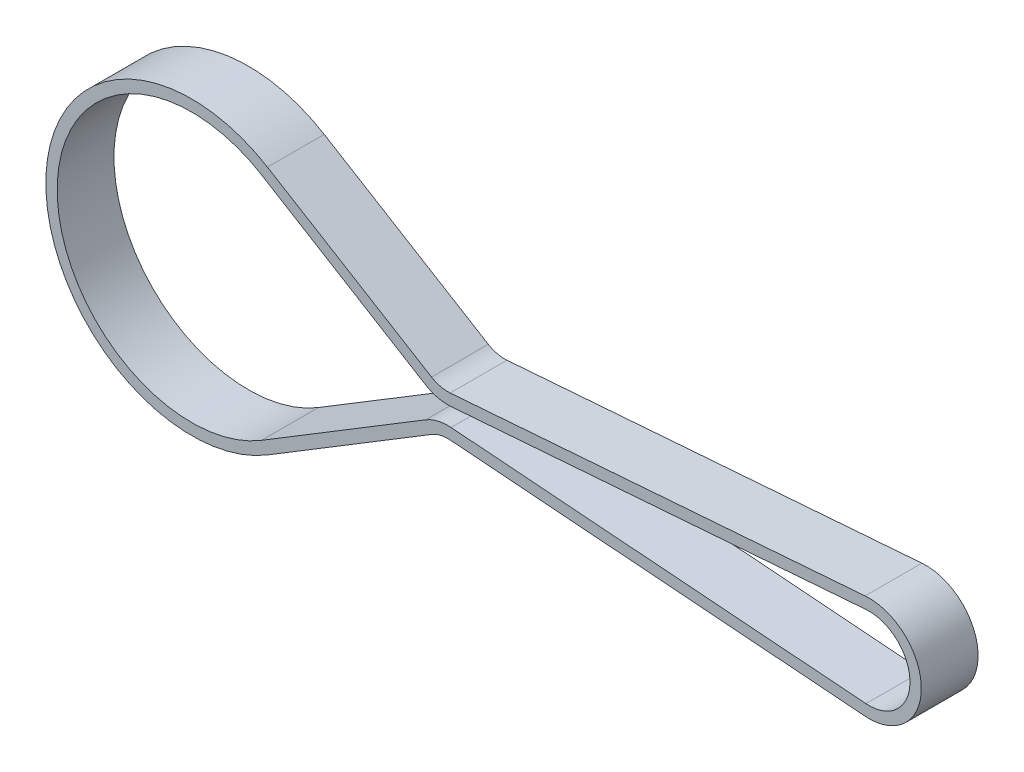
ISO-10303-21;
HEADER;
FILE_DESCRIPTION(('STEP AP214'),'2;1');
FILE_NAME('part.step','',(''),(''),'','','');
FILE_SCHEMA(('AUTOMOTIVE_DESIGN { 1 0 10303 214 1 1 1 1 }'));
ENDSEC;
DATA;
#1=APPLICATION_CONTEXT('core data for automotive mechanical design processes');
#2=APPLICATION_PROTOCOL_DEFINITION('international standard','automotive_design',2000,#1);
#3=PRODUCT_CONTEXT('',#1,'mechanical');
#4=PRODUCT('Part','Part','',(#3));
#5=PRODUCT_RELATED_PRODUCT_CATEGORY('part','',(#4));
#6=PRODUCT_DEFINITION_FORMATION('','',#4);
#7=PRODUCT_DEFINITION_CONTEXT('part definition',#1,'design');
#8=PRODUCT_DEFINITION('design','',#6,#7);
#9=PRODUCT_DEFINITION_SHAPE('','',#8);
#10=(LENGTH_UNIT() NAMED_UNIT(*) SI_UNIT(.MILLI.,.METRE.));
#11=(NAMED_UNIT(*) PLANE_ANGLE_UNIT() SI_UNIT($,.RADIAN.));
#12=(NAMED_UNIT(*) SI_UNIT($,.STERADIAN.) SOLID_ANGLE_UNIT());
#13=UNCERTAINTY_MEASURE_WITH_UNIT(LENGTH_MEASURE(1.E-05),#10,'distance_accuracy_value','');
#14=(GEOMETRIC_REPRESENTATION_CONTEXT(3) GLOBAL_UNCERTAINTY_ASSIGNED_CONTEXT((#13)) GLOBAL_UNIT_ASSIGNED_CONTEXT((#10,
#11,#12)) REPRESENTATION_CONTEXT('',''));
#15=CARTESIAN_POINT('',(0.,0.,0.));
#16=DIRECTION('',(0.,0.,1.));
#17=DIRECTION('',(1.,0.,0.));
#18=AXIS2_PLACEMENT_3D('',#15,#16,#17);
#19=CARTESIAN_POINT('',(-3.15406698387781,5.18620108642833,184.135803480875));
#20=DIRECTION('',(-0.519615593863488,0.854400160705682,0.));
#21=DIRECTION('',(-0.854400160705682,-0.519615593863488,0.));
#22=AXIS2_PLACEMENT_3D('',#19,#20,#21);
#23=PLANE('',#22);
#24=DIRECTION('',(0.854400160705682,0.519615593863488,0.));
#25=VECTOR('',#24,1.);
#26=CARTESIAN_POINT('',(-3.1540669838778,5.18620108642834,5.30000000000083));
#27=LINE('',#26,#25);
#28=CARTESIAN_POINT('',(-34.9478185611982,-14.1496205423417,5.30000000000083));
#29=VERTEX_POINT('',#28);
#30=CARTESIAN_POINT('',(-3.15406698387781,5.18620108642833,5.30000000000083));
#31=VERTEX_POINT('',#30);
#32=EDGE_CURVE('E295',#29,#31,#27,.T.);
#33=ORIENTED_EDGE('',*,*,#32,.F.);
#34=DIRECTION('',(0.,0.,-1.));
#35=VECTOR('',#34,1.);
#36=CARTESIAN_POINT('',(-34.9478185611982,-14.1496205423417,184.135803480875));
#37=LINE('',#36,#35);
#38=CARTESIAN_POINT('',(-34.9478185611982,-14.1496205423417,-5.69999999999917));
#39=VERTEX_POINT('',#38);
#40=EDGE_CURVE('E146',#29,#39,#37,.T.);
#41=ORIENTED_EDGE('',*,*,#40,.T.);
#42=DIRECTION('',(-0.854400160705682,-0.519615593863488,0.));
#43=VECTOR('',#42,1.);
#44=CARTESIAN_POINT('',(-3.15406698387782,5.18620108642833,-5.69999999999918));
#45=LINE('',#44,#43);
#46=CARTESIAN_POINT('',(-3.15406698387781,5.18620108642833,-5.69999999999918));
#47=VERTEX_POINT('',#46);
#48=EDGE_CURVE('E360',#47,#39,#45,.T.);
#49=ORIENTED_EDGE('',*,*,#48,.F.);
#50=DIRECTION('',(0.,0.,-1.));
#51=VECTOR('',#50,1.);
#52=CARTESIAN_POINT('',(-3.15406698387781,5.18620108642833,184.135803480875));
#53=LINE('',#52,#51);
#54=EDGE_CURVE('E251',#31,#47,#53,.T.);
#55=ORIENTED_EDGE('',*,*,#54,.F.);
#56=EDGE_LOOP('',(#33,#41,#49,#55));
#57=FACE_BOUND('',#56,.T.);
#58=ADVANCED_FACE('F131',(#57),#23,.F.);
#59=CARTESIAN_POINT('',(-49.6347533217497,10.0000000000044,184.135803480875));
#60=DIRECTION('',(0.,0.,-1.));
#61=DIRECTION('',(-1.,0.,0.));
#62=AXIS2_PLACEMENT_3D('',#59,#60,#61);
#63=CYLINDRICAL_SURFACE('',#62,28.265);
#64=CARTESIAN_POINT('',(-49.6347533217497,10.0000000000044,5.30000000000086));
#65=DIRECTION('',(0.,0.,1.));
#66=DIRECTION('',(0.,-1.,0.));
#67=AXIS2_PLACEMENT_3D('',#64,#65,#66);
#68=CIRCLE('',#67,28.265);
#69=CARTESIAN_POINT('',(-34.9478276516183,34.1496260708162,5.30000000000083));
#70=VERTEX_POINT('',#69);
#71=EDGE_CURVE('E298',#70,#29,#68,.T.);
#72=ORIENTED_EDGE('',*,*,#71,.F.);
#73=DIRECTION('',(0.,0.,-1.));
#74=VECTOR('',#73,1.);
#75=CARTESIAN_POINT('',(-34.9478276516183,34.1496260708162,184.135803480875));
#76=LINE('',#75,#74);
#77=CARTESIAN_POINT('',(-34.9478276516183,34.1496260708162,-5.69999999999915));
#78=VERTEX_POINT('',#77);
#79=EDGE_CURVE('E334',#70,#78,#76,.T.);
#80=ORIENTED_EDGE('',*,*,#79,.T.);
#81=CARTESIAN_POINT('',(-49.6347533217497,10.0000000000044,-5.69999999999915));
#82=DIRECTION('',(0.,0.,1.));
#83=DIRECTION('',(0.,-1.,0.));
#84=AXIS2_PLACEMENT_3D('',#81,#82,#83);
#85=CIRCLE('',#84,28.265);
#86=EDGE_CURVE('E361',#39,#78,#85,.F.);
#87=ORIENTED_EDGE('',*,*,#86,.F.);
#88=ORIENTED_EDGE('',*,*,#40,.F.);
#89=EDGE_LOOP('',(#72,#80,#87,#88));
#90=FACE_BOUND('',#89,.T.);
#91=ADVANCED_FACE('F411',(#90),#63,.T.);
#92=CARTESIAN_POINT('',(-34.9478276516183,34.1496260708162,184.135803480875));
#93=DIRECTION('',(-0.519615272249474,-0.85440035629973,0.));
#94=DIRECTION('',(0.85440035629973,-0.519615272249474,0.));
#95=AXIS2_PLACEMENT_3D('',#92,#93,#94);
#96=PLANE('',#95);
#97=DIRECTION('',(-0.85440035629973,0.519615272249474,0.));
#98=VECTOR('',#97,1.);
#99=CARTESIAN_POINT('',(-34.9478276516184,34.1496260708163,5.30000000000086));
#100=LINE('',#99,#98);
#101=CARTESIAN_POINT('',(-3.15406203695409,14.8138122993339,5.30000000000086));
#102=VERTEX_POINT('',#101);
#103=EDGE_CURVE('E301',#102,#70,#100,.T.);
#104=ORIENTED_EDGE('',*,*,#103,.F.);
#105=DIRECTION('',(0.,0.,-1.));
#106=VECTOR('',#105,1.);
#107=CARTESIAN_POINT('',(-3.15406203695409,14.8138122993339,184.135803480875));
#108=LINE('',#107,#106);
#109=CARTESIAN_POINT('',(-3.15406203695409,14.8138122993339,-5.69999999999915));
#110=VERTEX_POINT('',#109);
#111=EDGE_CURVE('E336',#102,#110,#108,.T.);
#112=ORIENTED_EDGE('',*,*,#111,.T.);
#113=DIRECTION('',(0.85440035629973,-0.519615272249474,0.));
#114=VECTOR('',#113,1.);
#115=CARTESIAN_POINT('',(-34.9478276516182,34.1496260708162,-5.69999999999915));
#116=LINE('',#115,#114);
#117=EDGE_CURVE('E363',#78,#110,#116,.T.);
#118=ORIENTED_EDGE('',*,*,#117,.F.);
#119=ORIENTED_EDGE('',*,*,#79,.F.);
#120=EDGE_LOOP('',(#104,#112,#118,#119));
#121=FACE_BOUND('',#120,.T.);
#122=ADVANCED_FACE('F416',(#121),#96,.F.);
#123=CARTESIAN_POINT('',(2.66560021278117E-06,20.0000224620733,184.135803480875));
#124=DIRECTION('',(0.,0.,-1.));
#125=DIRECTION('',(-1.,0.,0.));
#126=AXIS2_PLACEMENT_3D('',#123,#124,#125);
#127=CYLINDRICAL_SURFACE('',#126,6.07);
#128=CARTESIAN_POINT('',(2.66560021278117E-06,20.0000224620733,5.30000000000086));
#129=DIRECTION('',(0.,0.,1.));
#130=DIRECTION('',(0.,-1.,0.));
#131=AXIS2_PLACEMENT_3D('',#128,#129,#130);
#132=CIRCLE('',#131,6.07);
#133=CARTESIAN_POINT('',(0.462760138541055,13.9476877455166,5.30000000000086));
#134=VERTEX_POINT('',#133);
#135=EDGE_CURVE('E304',#134,#102,#132,.F.);
#136=ORIENTED_EDGE('',*,*,#135,.F.);
#137=DIRECTION('',(0.,0.,-1.));
#138=VECTOR('',#137,1.);
#139=CARTESIAN_POINT('',(0.462760138541055,13.9476877455166,184.135803480875));
#140=LINE('',#139,#138);
#141=CARTESIAN_POINT('',(0.462760138541055,13.9476877455166,-5.69999999999915));
#142=VERTEX_POINT('',#141);
#143=EDGE_CURVE('E338',#134,#142,#140,.T.);
#144=ORIENTED_EDGE('',*,*,#143,.T.);
#145=CARTESIAN_POINT('',(2.66560021278117E-06,20.0000224620733,-5.69999999999915));
#146=DIRECTION('',(0.,0.,1.));
#147=DIRECTION('',(0.,-1.,0.));
#148=AXIS2_PLACEMENT_3D('',#145,#146,#147);
#149=CIRCLE('',#148,6.07);
#150=EDGE_CURVE('E368',#110,#142,#149,.T.);
#151=ORIENTED_EDGE('',*,*,#150,.F.);
#152=ORIENTED_EDGE('',*,*,#111,.F.);
#153=EDGE_LOOP('',(#136,#144,#151,#152));
#154=FACE_BOUND('',#153,.T.);
#155=ADVANCED_FACE('F423',(#154),#127,.F.);
#156=CARTESIAN_POINT('',(0.462760138541055,13.9476877455166,184.135803480875));
#157=DIRECTION('',(0.0762368159704847,-0.997089739136194,0.));
#158=DIRECTION('',(0.997089739136194,0.0762368159704847,0.));
#159=AXIS2_PLACEMENT_3D('',#156,#157,#158);
#160=PLANE('',#159);
#161=DIRECTION('',(-0.997089739136194,-0.0762368159704847,0.));
#162=VECTOR('',#161,1.);
#163=CARTESIAN_POINT('',(0.462760138541009,13.9476877455166,5.30000000000086));
#164=LINE('',#163,#162);
#165=CARTESIAN_POINT('',(80.8695026026922,20.0955336087548,5.30000000000086));
#166=VERTEX_POINT('',#165);
#167=EDGE_CURVE('E307',#166,#134,#164,.T.);
#168=ORIENTED_EDGE('',*,*,#167,.F.);
#169=DIRECTION('',(0.,0.,-1.));
#170=VECTOR('',#169,1.);
#171=CARTESIAN_POINT('',(80.8695026026922,20.0955336087548,184.135803480875));
#172=LINE('',#171,#170);
#173=CARTESIAN_POINT('',(80.8695026026922,20.0955336087548,-5.69999999999917));
#174=VERTEX_POINT('',#173);
#175=EDGE_CURVE('E340',#166,#174,#172,.T.);
#176=ORIENTED_EDGE('',*,*,#175,.T.);
#177=DIRECTION('',(0.997089739136194,0.0762368159704847,0.));
#178=VECTOR('',#177,1.);
#179=CARTESIAN_POINT('',(0.462760138541101,13.9476877455166,-5.69999999999915));
#180=LINE('',#179,#178);
#181=EDGE_CURVE('E271',#142,#174,#180,.T.);
#182=ORIENTED_EDGE('',*,*,#181,.F.);
#183=ORIENTED_EDGE('',*,*,#143,.F.);
#184=EDGE_LOOP('',(#168,#176,#182,#183));
#185=FACE_BOUND('',#184,.T.);
#186=ADVANCED_FACE('F427',(#185),#160,.F.);
#187=CARTESIAN_POINT('',(81.6414003643934,10.0000000000008,184.135803480875));
#188=DIRECTION('',(0.,0.,-1.));
#189=DIRECTION('',(-1.,0.,0.));
#190=AXIS2_PLACEMENT_3D('',#187,#188,#189);
#191=CYLINDRICAL_SURFACE('',#190,10.125);
#192=CARTESIAN_POINT('',(81.6414003643934,10.0000000000008,5.30000000000083));
#193=DIRECTION('',(0.,0.,1.));
#194=DIRECTION('',(0.,-1.,0.));
#195=AXIS2_PLACEMENT_3D('',#192,#193,#194);
#196=CIRCLE('',#195,10.125);
#197=CARTESIAN_POINT('',(80.8695008121819,-0.0955334718517834,5.30000000000083));
#198=VERTEX_POINT('',#197);
#199=EDGE_CURVE('E310',#198,#166,#196,.T.);
#200=ORIENTED_EDGE('',*,*,#199,.F.);
#201=DIRECTION('',(0.,0.,-1.));
#202=VECTOR('',#201,1.);
#203=CARTESIAN_POINT('',(80.8695008121819,-0.0955334718517834,184.135803480875));
#204=LINE('',#203,#202);
#205=CARTESIAN_POINT('',(80.8695008121819,-0.0955334718517834,-5.69999999999921));
#206=VERTEX_POINT('',#205);
#207=EDGE_CURVE('E342',#198,#206,#204,.T.);
#208=ORIENTED_EDGE('',*,*,#207,.T.);
#209=CARTESIAN_POINT('',(81.6414003643934,10.0000000000008,-5.69999999999918));
#210=DIRECTION('',(0.,0.,1.));
#211=DIRECTION('',(0.,-1.,0.));
#212=AXIS2_PLACEMENT_3D('',#209,#210,#211);
#213=CIRCLE('',#212,10.125);
#214=EDGE_CURVE('E268',#174,#206,#213,.F.);
#215=ORIENTED_EDGE('',*,*,#214,.F.);
#216=ORIENTED_EDGE('',*,*,#175,.F.);
#217=EDGE_LOOP('',(#200,#208,#215,#216));
#218=FACE_BOUND('',#217,.T.);
#219=ADVANCED_FACE('F431',(#218),#191,.T.);
#220=CARTESIAN_POINT('',(80.8695008121819,-0.0955334718517834,184.135803480875));
#221=DIRECTION('',(0.0762369928110102,0.997089725615069,0.));
#222=DIRECTION('',(-0.997089725615069,0.0762369928110102,0.));
#223=AXIS2_PLACEMENT_3D('',#220,#221,#222);
#224=PLANE('',#223);
#225=DIRECTION('',(0.997089725615069,-0.0762369928110102,0.));
#226=VECTOR('',#225,1.);
#227=CARTESIAN_POINT('',(80.8695008121818,-0.0955334718517786,5.3000000000008));
#228=LINE('',#227,#226);
#229=CARTESIAN_POINT('',(0.462758217236398,6.05232674542831,5.3000000000008));
#230=VERTEX_POINT('',#229);
#231=EDGE_CURVE('E313',#230,#198,#228,.T.);
#232=ORIENTED_EDGE('',*,*,#231,.F.);
#233=DIRECTION('',(0.,0.,-1.));
#234=VECTOR('',#233,1.);
#235=CARTESIAN_POINT('',(0.462758217236398,6.05232674542831,184.135803480875));
#236=LINE('',#235,#234);
#237=CARTESIAN_POINT('',(0.462758217236403,6.05232674542831,-5.69999999999918));
#238=VERTEX_POINT('',#237);
#239=EDGE_CURVE('E139',#230,#238,#236,.T.);
#240=ORIENTED_EDGE('',*,*,#239,.T.);
#241=DIRECTION('',(-0.997089725615069,0.0762369928110102,0.));
#242=VECTOR('',#241,1.);
#243=CARTESIAN_POINT('',(80.869500812182,-0.0955334718517883,-5.69999999999921));
#244=LINE('',#243,#242);
#245=EDGE_CURVE('E280',#206,#238,#244,.T.);
#246=ORIENTED_EDGE('',*,*,#245,.F.);
#247=ORIENTED_EDGE('',*,*,#207,.F.);
#248=EDGE_LOOP('',(#232,#240,#246,#247));
#249=FACE_BOUND('',#248,.T.);
#250=ADVANCED_FACE('F347',(#249),#224,.F.);
#251=CARTESIAN_POINT('',(-3.29126434439608E-07,-7.88905515913818E-06,184.135803480875));
#252=DIRECTION('',(0.,0.,-1.));
#253=DIRECTION('',(-1.,0.,0.));
#254=AXIS2_PLACEMENT_3D('',#251,#252,#253);
#255=CYLINDRICAL_SURFACE('',#254,6.07);
#256=CARTESIAN_POINT('',(-3.29126434439608E-07,-7.88905515913818E-06,5.30000000000083));
#257=DIRECTION('',(0.,0.,1.));
#258=DIRECTION('',(0.,-1.,0.));
#259=AXIS2_PLACEMENT_3D('',#256,#257,#258);
#260=CIRCLE('',#259,6.07);
#261=EDGE_CURVE('E316',#31,#230,#260,.F.);
#262=ORIENTED_EDGE('',*,*,#261,.F.);
#263=ORIENTED_EDGE('',*,*,#54,.T.);
#264=CARTESIAN_POINT('',(-3.29126434439608E-07,-7.88905515913818E-06,-5.69999999999918));
#265=DIRECTION('',(0.,0.,1.));
#266=DIRECTION('',(0.,-1.,0.));
#267=AXIS2_PLACEMENT_3D('',#264,#265,#266);
#268=CIRCLE('',#267,6.07);
#269=EDGE_CURVE('E264',#238,#47,#268,.T.);
#270=ORIENTED_EDGE('',*,*,#269,.F.);
#271=ORIENTED_EDGE('',*,*,#239,.F.);
#272=EDGE_LOOP('',(#262,#263,#270,#271));
#273=FACE_BOUND('',#272,.T.);
#274=ADVANCED_FACE('F133',(#273),#255,.F.);
#275=CARTESIAN_POINT('',(-4.29722129037748,7.06588143998083,184.135803480875));
#276=DIRECTION('',(-0.519615593863488,0.854400160705682,0.));
#277=DIRECTION('',(-0.854400160705682,-0.519615593863488,0.));
#278=AXIS2_PLACEMENT_3D('',#275,#276,#277);
#279=PLANE('',#278);
#280=DIRECTION('',(0.,0.,-1.));
#281=VECTOR('',#280,1.);
#282=CARTESIAN_POINT('',(-36.0909728676979,-12.2699401887892,184.135803480875));
#283=LINE('',#282,#281);
#284=CARTESIAN_POINT('',(-36.0909728676979,-12.2699401887892,5.30000000000083));
#285=VERTEX_POINT('',#284);
#286=CARTESIAN_POINT('',(-36.0909728676979,-12.2699401887892,-5.69999999999917));
#287=VERTEX_POINT('',#286);
#288=EDGE_CURVE('E321',#285,#287,#283,.T.);
#289=ORIENTED_EDGE('',*,*,#288,.F.);
#290=DIRECTION('',(0.854400160705682,0.519615593863488,0.));
#291=VECTOR('',#290,1.);
#292=CARTESIAN_POINT('',(-4.29722129037747,7.06588143998084,5.30000000000083));
#293=LINE('',#292,#291);
#294=CARTESIAN_POINT('',(-4.29722129037748,7.06588143998083,5.30000000000083));
#295=VERTEX_POINT('',#294);
#296=EDGE_CURVE('E12',#285,#295,#293,.T.);
#297=ORIENTED_EDGE('',*,*,#296,.T.);
#298=DIRECTION('',(0.,0.,-1.));
#299=VECTOR('',#298,1.);
#300=CARTESIAN_POINT('',(-4.29722129037748,7.06588143998083,184.135803480875));
#301=LINE('',#300,#299);
#302=CARTESIAN_POINT('',(-4.29722129037748,7.06588143998083,-5.69999999999918));
#303=VERTEX_POINT('',#302);
#304=EDGE_CURVE('E319',#295,#303,#301,.T.);
#305=ORIENTED_EDGE('',*,*,#304,.T.);
#306=DIRECTION('',(-0.854400160705682,-0.519615593863488,0.));
#307=VECTOR('',#306,1.);
#308=CARTESIAN_POINT('',(-4.29722129037749,7.06588143998083,-5.69999999999918));
#309=LINE('',#308,#307);
#310=EDGE_CURVE('E263',#303,#287,#309,.T.);
#311=ORIENTED_EDGE('',*,*,#310,.T.);
#312=EDGE_LOOP('',(#289,#297,#305,#311));
#313=FACE_BOUND('',#312,.T.);
#314=ADVANCED_FACE('F404',(#313),#279,.T.);
#315=CARTESIAN_POINT('',(-49.6347533217497,10.0000000000044,184.135803480875));
#316=DIRECTION('',(0.,0.,-1.));
#317=DIRECTION('',(-1.,0.,0.));
#318=AXIS2_PLACEMENT_3D('',#315,#316,#317);
#319=CYLINDRICAL_SURFACE('',#318,26.065);
#320=DIRECTION('',(0.,0.,-1.));
#321=VECTOR('',#320,1.);
#322=CARTESIAN_POINT('',(-36.0909812505672,32.2699452869568,184.135803480875));
#323=LINE('',#322,#321);
#324=CARTESIAN_POINT('',(-36.0909812505672,32.2699452869568,5.30000000000087));
#325=VERTEX_POINT('',#324);
#326=CARTESIAN_POINT('',(-36.0909812505672,32.2699452869568,-5.69999999999915));
#327=VERTEX_POINT('',#326);
#328=EDGE_CURVE('E323',#325,#327,#323,.T.);
#329=ORIENTED_EDGE('',*,*,#328,.F.);
#330=CARTESIAN_POINT('',(-49.6347533217497,10.0000000000044,5.30000000000086));
#331=DIRECTION('',(0.,0.,1.));
#332=DIRECTION('',(0.,-1.,0.));
#333=AXIS2_PLACEMENT_3D('',#330,#331,#332);
#334=CIRCLE('',#333,26.065);
#335=EDGE_CURVE('E276',#325,#285,#334,.T.);
#336=ORIENTED_EDGE('',*,*,#335,.T.);
#337=ORIENTED_EDGE('',*,*,#288,.T.);
#338=CARTESIAN_POINT('',(-49.6347533217497,10.0000000000044,-5.69999999999915));
#339=DIRECTION('',(0.,0.,1.));
#340=DIRECTION('',(0.,-1.,0.));
#341=AXIS2_PLACEMENT_3D('',#338,#339,#340);
#342=CIRCLE('',#341,26.065);
#343=EDGE_CURVE('E373',#287,#327,#342,.F.);
#344=ORIENTED_EDGE('',*,*,#343,.T.);
#345=EDGE_LOOP('',(#329,#336,#337,#344));
#346=FACE_BOUND('',#345,.T.);
#347=ADVANCED_FACE('F401',(#346),#319,.F.);
#348=CARTESIAN_POINT('',(-36.0909812505672,32.2699452869568,184.135803480875));
#349=DIRECTION('',(-0.519615272249474,-0.85440035629973,0.));
#350=DIRECTION('',(0.85440035629973,-0.519615272249474,0.));
#351=AXIS2_PLACEMENT_3D('',#348,#349,#350);
#352=PLANE('',#351);
#353=DIRECTION('',(0.,0.,-1.));
#354=VECTOR('',#353,1.);
#355=CARTESIAN_POINT('',(-4.29721563590293,12.9341315154745,184.135803480875));
#356=LINE('',#355,#354);
#357=CARTESIAN_POINT('',(-4.29721563590293,12.9341315154745,5.30000000000084));
#358=VERTEX_POINT('',#357);
#359=CARTESIAN_POINT('',(-4.29721563590293,12.9341315154745,-5.69999999999915));
#360=VERTEX_POINT('',#359);
#361=EDGE_CURVE('E325',#358,#360,#356,.T.);
#362=ORIENTED_EDGE('',*,*,#361,.F.);
#363=DIRECTION('',(-0.85440035629973,0.519615272249474,0.));
#364=VECTOR('',#363,1.);
#365=CARTESIAN_POINT('',(-36.0909812505672,32.2699452869569,5.30000000000086));
#366=LINE('',#365,#364);
#367=EDGE_CURVE('E279',#358,#325,#366,.T.);
#368=ORIENTED_EDGE('',*,*,#367,.T.);
#369=ORIENTED_EDGE('',*,*,#328,.T.);
#370=DIRECTION('',(0.85440035629973,-0.519615272249474,0.));
#371=VECTOR('',#370,1.);
#372=CARTESIAN_POINT('',(-36.0909812505671,32.2699452869568,-5.69999999999915));
#373=LINE('',#372,#371);
#374=EDGE_CURVE('E376',#327,#360,#373,.T.);
#375=ORIENTED_EDGE('',*,*,#374,.T.);
#376=EDGE_LOOP('',(#362,#368,#369,#375));
#377=FACE_BOUND('',#376,.T.);
#378=ADVANCED_FACE('F398',(#377),#352,.T.);
#379=CARTESIAN_POINT('',(2.66560021278117E-06,20.0000224620733,184.135803480875));
#380=DIRECTION('',(0.,0.,-1.));
#381=DIRECTION('',(-1.,0.,0.));
#382=AXIS2_PLACEMENT_3D('',#379,#380,#381);
#383=CYLINDRICAL_SURFACE('',#382,8.27);
#384=DIRECTION('',(0.,0.,-1.));
#385=VECTOR('',#384,1.);
#386=CARTESIAN_POINT('',(0.630481133676121,11.754090319417,184.135803480875));
#387=LINE('',#386,#385);
#388=CARTESIAN_POINT('',(0.630481133676121,11.754090319417,5.30000000000085));
#389=VERTEX_POINT('',#388);
#390=CARTESIAN_POINT('',(0.630481133676121,11.754090319417,-5.69999999999918));
#391=VERTEX_POINT('',#390);
#392=EDGE_CURVE('E327',#389,#391,#387,.T.);
#393=ORIENTED_EDGE('',*,*,#392,.F.);
#394=CARTESIAN_POINT('',(2.66560021278117E-06,20.0000224620733,5.30000000000086));
#395=DIRECTION('',(0.,0.,1.));
#396=DIRECTION('',(0.,-1.,0.));
#397=AXIS2_PLACEMENT_3D('',#394,#395,#396);
#398=CIRCLE('',#397,8.27);
#399=EDGE_CURVE('E283',#389,#358,#398,.F.);
#400=ORIENTED_EDGE('',*,*,#399,.T.);
#401=ORIENTED_EDGE('',*,*,#361,.T.);
#402=CARTESIAN_POINT('',(2.66560021278117E-06,20.0000224620733,-5.69999999999915));
#403=DIRECTION('',(0.,0.,1.));
#404=DIRECTION('',(0.,-1.,0.));
#405=AXIS2_PLACEMENT_3D('',#402,#403,#404);
#406=CIRCLE('',#405,8.27);
#407=EDGE_CURVE('E379',#360,#391,#406,.T.);
#408=ORIENTED_EDGE('',*,*,#407,.T.);
#409=EDGE_LOOP('',(#393,#400,#401,#408));
#410=FACE_BOUND('',#409,.T.);
#411=ADVANCED_FACE('F394',(#410),#383,.T.);
#412=CARTESIAN_POINT('',(0.630481133676121,11.754090319417,184.135803480875));
#413=DIRECTION('',(0.0762368159704847,-0.997089739136194,0.));
#414=DIRECTION('',(0.997089739136194,0.0762368159704847,0.));
#415=AXIS2_PLACEMENT_3D('',#412,#413,#414);
#416=PLANE('',#415);
#417=DIRECTION('',(0.,0.,-1.));
#418=VECTOR('',#417,1.);
#419=CARTESIAN_POINT('',(81.0372235978273,17.9019361826551,184.135803480875));
#420=LINE('',#419,#418);
#421=CARTESIAN_POINT('',(81.0372235978273,17.9019361826551,5.30000000000081));
#422=VERTEX_POINT('',#421);
#423=CARTESIAN_POINT('',(81.0372235978273,17.9019361826551,-5.69999999999917));
#424=VERTEX_POINT('',#423);
#425=EDGE_CURVE('E329',#422,#424,#420,.T.);
#426=ORIENTED_EDGE('',*,*,#425,.F.);
#427=DIRECTION('',(-0.997089739136194,-0.0762368159704847,0.));
#428=VECTOR('',#427,1.);
#429=CARTESIAN_POINT('',(0.630481133676075,11.754090319417,5.30000000000083));
#430=LINE('',#429,#428);
#431=EDGE_CURVE('E286',#422,#389,#430,.T.);
#432=ORIENTED_EDGE('',*,*,#431,.T.);
#433=ORIENTED_EDGE('',*,*,#392,.T.);
#434=DIRECTION('',(0.997089739136194,0.0762368159704847,0.));
#435=VECTOR('',#434,1.);
#436=CARTESIAN_POINT('',(0.630481133676167,11.754090319417,-5.69999999999918));
#437=LINE('',#436,#435);
#438=EDGE_CURVE('E382',#391,#424,#437,.T.);
#439=ORIENTED_EDGE('',*,*,#438,.T.);
#440=EDGE_LOOP('',(#426,#432,#433,#439));
#441=FACE_BOUND('',#440,.T.);
#442=ADVANCED_FACE('F391',(#441),#416,.T.);
#443=CARTESIAN_POINT('',(81.6414003643934,10.0000000000008,184.135803480875));
#444=DIRECTION('',(0.,0.,-1.));
#445=DIRECTION('',(-1.,0.,0.));
#446=AXIS2_PLACEMENT_3D('',#443,#444,#445);
#447=CYLINDRICAL_SURFACE('',#446,7.925);
#448=DIRECTION('',(0.,0.,-1.));
#449=VECTOR('',#448,1.);
#450=CARTESIAN_POINT('',(81.0372221963661,2.09806392450137,184.135803480875));
#451=LINE('',#450,#449);
#452=CARTESIAN_POINT('',(81.0372221963661,2.09806392450137,5.30000000000083));
#453=VERTEX_POINT('',#452);
#454=CARTESIAN_POINT('',(81.0372221963661,2.09806392450137,-5.69999999999921));
#455=VERTEX_POINT('',#454);
#456=EDGE_CURVE('E252',#453,#455,#451,.T.);
#457=ORIENTED_EDGE('',*,*,#456,.F.);
#458=CARTESIAN_POINT('',(81.6414003643934,10.0000000000008,5.30000000000083));
#459=DIRECTION('',(0.,0.,1.));
#460=DIRECTION('',(0.,-1.,0.));
#461=AXIS2_PLACEMENT_3D('',#458,#459,#460);
#462=CIRCLE('',#461,7.925);
#463=EDGE_CURVE('E289',#453,#422,#462,.T.);
#464=ORIENTED_EDGE('',*,*,#463,.T.);
#465=ORIENTED_EDGE('',*,*,#425,.T.);
#466=CARTESIAN_POINT('',(81.6414003643934,10.0000000000008,-5.69999999999918));
#467=DIRECTION('',(0.,0.,1.));
#468=DIRECTION('',(0.,-1.,0.));
#469=AXIS2_PLACEMENT_3D('',#466,#467,#468);
#470=CIRCLE('',#469,7.925);
#471=EDGE_CURVE('E358',#424,#455,#470,.F.);
#472=ORIENTED_EDGE('',*,*,#471,.T.);
#473=EDGE_LOOP('',(#457,#464,#465,#472));
#474=FACE_BOUND('',#473,.T.);
#475=ADVANCED_FACE('F386',(#474),#447,.F.);
#476=CARTESIAN_POINT('',(81.0372221963661,2.09806392450137,184.135803480875));
#477=DIRECTION('',(0.0762369928110102,0.997089725615069,0.));
#478=DIRECTION('',(-0.997089725615069,0.0762369928110102,0.));
#479=AXIS2_PLACEMENT_3D('',#476,#477,#478);
#480=PLANE('',#479);
#481=DIRECTION('',(0.,0.,-1.));
#482=VECTOR('',#481,1.);
#483=CARTESIAN_POINT('',(0.630479601420639,8.24592414178147,184.135803480875));
#484=LINE('',#483,#482);
#485=CARTESIAN_POINT('',(0.630479601420639,8.24592414178147,5.30000000000083));
#486=VERTEX_POINT('',#485);
#487=CARTESIAN_POINT('',(0.630479601420639,8.24592414178147,-5.69999999999921));
#488=VERTEX_POINT('',#487);
#489=EDGE_CURVE('E244',#486,#488,#484,.T.);
#490=ORIENTED_EDGE('',*,*,#489,.F.);
#491=DIRECTION('',(0.997089725615069,-0.0762369928110102,0.));
#492=VECTOR('',#491,1.);
#493=CARTESIAN_POINT('',(81.0372221963661,2.09806392450137,5.3000000000008));
#494=LINE('',#493,#492);
#495=EDGE_CURVE('E292',#486,#453,#494,.T.);
#496=ORIENTED_EDGE('',*,*,#495,.T.);
#497=ORIENTED_EDGE('',*,*,#456,.T.);
#498=DIRECTION('',(-0.997089725615069,0.0762369928110103,0.));
#499=VECTOR('',#498,1.);
#500=CARTESIAN_POINT('',(81.0372221963662,2.09806392450136,-5.69999999999921));
#501=LINE('',#500,#499);
#502=EDGE_CURVE('E259',#455,#488,#501,.T.);
#503=ORIENTED_EDGE('',*,*,#502,.T.);
#504=EDGE_LOOP('',(#490,#496,#497,#503));
#505=FACE_BOUND('',#504,.T.);
#506=ADVANCED_FACE('F266',(#505),#480,.T.);
#507=CARTESIAN_POINT('',(-3.29126434439608E-07,-7.88905515913818E-06,184.135803480875));
#508=DIRECTION('',(0.,0.,-1.));
#509=DIRECTION('',(-1.,0.,0.));
#510=AXIS2_PLACEMENT_3D('',#507,#508,#509);
#511=CYLINDRICAL_SURFACE('',#510,8.27);
#512=ORIENTED_EDGE('',*,*,#304,.F.);
#513=CARTESIAN_POINT('',(-3.29126434439608E-07,-7.88905515913818E-06,5.30000000000083));
#514=DIRECTION('',(0.,0.,1.));
#515=DIRECTION('',(0.,-1.,0.));
#516=AXIS2_PLACEMENT_3D('',#513,#514,#515);
#517=CIRCLE('',#516,8.27);
#518=EDGE_CURVE('E154',#295,#486,#517,.F.);
#519=ORIENTED_EDGE('',*,*,#518,.T.);
#520=ORIENTED_EDGE('',*,*,#489,.T.);
#521=CARTESIAN_POINT('',(-3.29126434439608E-07,-7.88905515913818E-06,-5.69999999999918));
#522=DIRECTION('',(0.,0.,1.));
#523=DIRECTION('',(0.,-1.,0.));
#524=AXIS2_PLACEMENT_3D('',#521,#522,#523);
#525=CIRCLE('',#524,8.27);
#526=EDGE_CURVE('E247',#488,#303,#525,.T.);
#527=ORIENTED_EDGE('',*,*,#526,.T.);
#528=EDGE_LOOP('',(#512,#519,#520,#527));
#529=FACE_BOUND('',#528,.T.);
#530=ADVANCED_FACE('F246',(#529),#511,.T.);
#531=CARTESIAN_POINT('',(-49.6347533217512,10.0000000000041,5.30000000000085));
#532=DIRECTION('',(0.,0.,1.));
#533=DIRECTION('',(-0.46599693375556,-0.884786334507047,0.));
#534=AXIS2_PLACEMENT_3D('',#531,#532,#533);
#535=PLANE('',#534);
#536=ORIENTED_EDGE('',*,*,#518,.F.);
#537=ORIENTED_EDGE('',*,*,#296,.F.);
#538=ORIENTED_EDGE('',*,*,#335,.F.);
#539=ORIENTED_EDGE('',*,*,#367,.F.);
#540=ORIENTED_EDGE('',*,*,#399,.F.);
#541=ORIENTED_EDGE('',*,*,#431,.F.);
#542=ORIENTED_EDGE('',*,*,#463,.F.);
#543=ORIENTED_EDGE('',*,*,#495,.F.);
#544=EDGE_LOOP('',(#536,#537,#538,#539,#540,#541,#542,#543));
#545=FACE_BOUND('',#544,.T.);
#546=ORIENTED_EDGE('',*,*,#32,.T.);
#547=ORIENTED_EDGE('',*,*,#261,.T.);
#548=ORIENTED_EDGE('',*,*,#231,.T.);
#549=ORIENTED_EDGE('',*,*,#199,.T.);
#550=ORIENTED_EDGE('',*,*,#167,.T.);
#551=ORIENTED_EDGE('',*,*,#135,.T.);
#552=ORIENTED_EDGE('',*,*,#103,.T.);
#553=ORIENTED_EDGE('',*,*,#71,.T.);
#554=EDGE_LOOP('',(#546,#547,#548,#549,#550,#551,#552,#553));
#555=FACE_BOUND('',#554,.T.);
#556=ADVANCED_FACE('F405',(#545,#555),#535,.T.);
#557=CARTESIAN_POINT('',(-49.6347533217512,10.0000000000039,-5.69999999999915));
#558=DIRECTION('',(0.,0.,1.));
#559=DIRECTION('',(-0.46599693375556,-0.884786334507047,0.));
#560=AXIS2_PLACEMENT_3D('',#557,#558,#559);
#561=PLANE('',#560);
#562=ORIENTED_EDGE('',*,*,#269,.T.);
#563=ORIENTED_EDGE('',*,*,#48,.T.);
#564=ORIENTED_EDGE('',*,*,#86,.T.);
#565=ORIENTED_EDGE('',*,*,#117,.T.);
#566=ORIENTED_EDGE('',*,*,#150,.T.);
#567=ORIENTED_EDGE('',*,*,#181,.T.);
#568=ORIENTED_EDGE('',*,*,#214,.T.);
#569=ORIENTED_EDGE('',*,*,#245,.T.);
#570=EDGE_LOOP('',(#562,#563,#564,#565,#566,#567,#568,#569));
#571=FACE_BOUND('',#570,.T.);
#572=ORIENTED_EDGE('',*,*,#502,.F.);
#573=ORIENTED_EDGE('',*,*,#471,.F.);
#574=ORIENTED_EDGE('',*,*,#438,.F.);
#575=ORIENTED_EDGE('',*,*,#407,.F.);
#576=ORIENTED_EDGE('',*,*,#374,.F.);
#577=ORIENTED_EDGE('',*,*,#343,.F.);
#578=ORIENTED_EDGE('',*,*,#310,.F.);
#579=ORIENTED_EDGE('',*,*,#526,.F.);
#580=EDGE_LOOP('',(#572,#573,#574,#575,#576,#577,#578,#579));
#581=FACE_BOUND('',#580,.T.);
#582=ADVANCED_FACE('F257',(#571,#581),#561,.F.);
#583=CLOSED_SHELL('',(#58,#91,#122,#155,#186,#219,#250,#274,#314,#347,#378,#411,#442,#475,#506,
#530,#556,#582));
#584=MANIFOLD_SOLID_BREP('B2',#583);
#585=ADVANCED_BREP_SHAPE_REPRESENTATION('',(#18,#584),#14);
#586=SHAPE_DEFINITION_REPRESENTATION(#9,#585);
ENDSEC;
END-ISO-10303-21;
